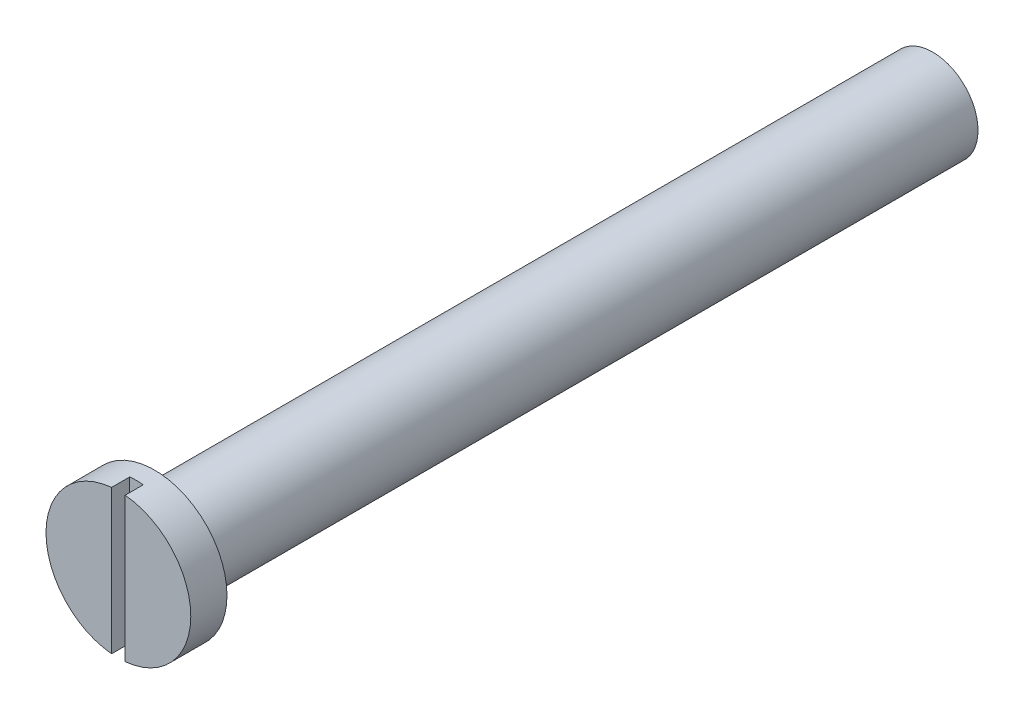
ISO-10303-21;
HEADER;
FILE_DESCRIPTION(('STEP AP214'),'2;1');
FILE_NAME('part.step','',(''),(''),'','','');
FILE_SCHEMA(('AUTOMOTIVE_DESIGN { 1 0 10303 214 1 1 1 1 }'));
ENDSEC;
DATA;
#1=APPLICATION_CONTEXT('core data for automotive mechanical design processes');
#2=APPLICATION_PROTOCOL_DEFINITION('international standard','automotive_design',2000,#1);
#3=PRODUCT_CONTEXT('',#1,'mechanical');
#4=PRODUCT('Part','Part','',(#3));
#5=PRODUCT_RELATED_PRODUCT_CATEGORY('part','',(#4));
#6=PRODUCT_DEFINITION_FORMATION('','',#4);
#7=PRODUCT_DEFINITION_CONTEXT('part definition',#1,'design');
#8=PRODUCT_DEFINITION('design','',#6,#7);
#9=PRODUCT_DEFINITION_SHAPE('','',#8);
#10=(LENGTH_UNIT() NAMED_UNIT(*) SI_UNIT(.MILLI.,.METRE.));
#11=(NAMED_UNIT(*) PLANE_ANGLE_UNIT() SI_UNIT($,.RADIAN.));
#12=(NAMED_UNIT(*) SI_UNIT($,.STERADIAN.) SOLID_ANGLE_UNIT());
#13=UNCERTAINTY_MEASURE_WITH_UNIT(LENGTH_MEASURE(1.E-05),#10,'distance_accuracy_value','');
#14=(GEOMETRIC_REPRESENTATION_CONTEXT(3) GLOBAL_UNCERTAINTY_ASSIGNED_CONTEXT((#13)) GLOBAL_UNIT_ASSIGNED_CONTEXT((#10,
#11,#12)) REPRESENTATION_CONTEXT('',''));
#15=CARTESIAN_POINT('',(0.,0.,0.));
#16=DIRECTION('',(0.,0.,1.));
#17=DIRECTION('',(1.,0.,0.));
#18=AXIS2_PLACEMENT_3D('',#15,#16,#17);
#19=CARTESIAN_POINT('',(0.,0.,90.));
#20=DIRECTION('',(0.,0.,1.));
#21=DIRECTION('',(1.,0.,0.));
#22=AXIS2_PLACEMENT_3D('',#19,#20,#21);
#23=PLANE('',#22);
#24=DIRECTION('',(0.,1.,0.));
#25=VECTOR('',#24,1.);
#26=CARTESIAN_POINT('',(0.75,0.,90.));
#27=LINE('',#26,#25);
#28=CARTESIAN_POINT('',(0.75,-7.96476616103699,90.));
#29=VERTEX_POINT('',#28);
#30=CARTESIAN_POINT('',(0.75,7.964766161037,90.));
#31=VERTEX_POINT('',#30);
#32=EDGE_CURVE('E124',#29,#31,#27,.T.);
#33=ORIENTED_EDGE('',*,*,#32,.F.);
#34=CARTESIAN_POINT('',(0.,0.,90.));
#35=DIRECTION('',(0.,0.,1.));
#36=DIRECTION('',(1.,0.,0.));
#37=AXIS2_PLACEMENT_3D('',#34,#35,#36);
#38=CIRCLE('',#37,8.);
#39=EDGE_CURVE('E111',#29,#31,#38,.T.);
#40=ORIENTED_EDGE('',*,*,#39,.T.);
#41=EDGE_LOOP('',(#33,#40));
#42=FACE_BOUND('',#41,.T.);
#43=ADVANCED_FACE('F39',(#42),#23,.T.);
#44=CARTESIAN_POINT('',(0.,0.,86.));
#45=DIRECTION('',(0.,0.,-1.));
#46=DIRECTION('',(-1.,0.,0.));
#47=AXIS2_PLACEMENT_3D('',#44,#45,#46);
#48=CYLINDRICAL_SURFACE('',#47,5.);
#49=CARTESIAN_POINT('',(0.,0.,86.));
#50=DIRECTION('',(0.,0.,1.));
#51=DIRECTION('',(1.,0.,0.));
#52=AXIS2_PLACEMENT_3D('',#49,#50,#51);
#53=CIRCLE('',#52,5.);
#54=CARTESIAN_POINT('',(5.,0.,86.));
#55=VERTEX_POINT('',#54);
#56=EDGE_CURVE('E117',#55,#55,#53,.T.);
#57=ORIENTED_EDGE('',*,*,#56,.F.);
#58=EDGE_LOOP('',(#57));
#59=FACE_BOUND('',#58,.T.);
#60=CARTESIAN_POINT('',(0.,0.,0.));
#61=DIRECTION('',(0.,0.,1.));
#62=DIRECTION('',(1.,0.,0.));
#63=AXIS2_PLACEMENT_3D('',#60,#61,#62);
#64=CIRCLE('',#63,5.);
#65=CARTESIAN_POINT('',(5.,0.,0.));
#66=VERTEX_POINT('',#65);
#67=EDGE_CURVE('E121',#66,#66,#64,.T.);
#68=ORIENTED_EDGE('',*,*,#67,.T.);
#69=EDGE_LOOP('',(#68));
#70=FACE_BOUND('',#69,.T.);
#71=ADVANCED_FACE('F41',(#59,#70),#48,.T.);
#72=CARTESIAN_POINT('',(0.,0.,0.));
#73=DIRECTION('',(0.,0.,1.));
#74=DIRECTION('',(1.,0.,0.));
#75=AXIS2_PLACEMENT_3D('',#72,#73,#74);
#76=PLANE('',#75);
#77=CARTESIAN_POINT('',(0.,0.,0.));
#78=DIRECTION('',(0.,0.,-1.));
#79=DIRECTION('',(-1.,0.,0.));
#80=AXIS2_PLACEMENT_3D('',#77,#78,#79);
#81=CIRCLE('',#80,3.4);
#82=CARTESIAN_POINT('',(-3.4,0.,0.));
#83=VERTEX_POINT('',#82);
#84=EDGE_CURVE('E93',#83,#83,#81,.T.);
#85=ORIENTED_EDGE('',*,*,#84,.F.);
#86=EDGE_LOOP('',(#85));
#87=FACE_BOUND('',#86,.T.);
#88=ORIENTED_EDGE('',*,*,#67,.F.);
#89=EDGE_LOOP('',(#88));
#90=FACE_BOUND('',#89,.T.);
#91=ADVANCED_FACE('F142',(#87,#90),#76,.F.);
#92=CARTESIAN_POINT('',(0.,0.,90.));
#93=DIRECTION('',(0.,0.,-1.));
#94=DIRECTION('',(-1.,0.,0.));
#95=AXIS2_PLACEMENT_3D('',#92,#93,#94);
#96=CYLINDRICAL_SURFACE('',#95,8.);
#97=CARTESIAN_POINT('',(0.,0.,88.));
#98=DIRECTION('',(0.,0.,1.));
#99=DIRECTION('',(1.,0.,0.));
#100=AXIS2_PLACEMENT_3D('',#97,#98,#99);
#101=CIRCLE('',#100,8.);
#102=CARTESIAN_POINT('',(0.75,7.964766161037,88.));
#103=VERTEX_POINT('',#102);
#104=CARTESIAN_POINT('',(-0.75,7.96476616103699,88.));
#105=VERTEX_POINT('',#104);
#106=EDGE_CURVE('E11',#103,#105,#101,.T.);
#107=ORIENTED_EDGE('',*,*,#106,.F.);
#108=DIRECTION('',(0.,0.,-1.));
#109=VECTOR('',#108,1.);
#110=CARTESIAN_POINT('',(0.75,7.964766161037,90.));
#111=LINE('',#110,#109);
#112=EDGE_CURVE('E62',#103,#31,#111,.F.);
#113=ORIENTED_EDGE('',*,*,#112,.T.);
#114=ORIENTED_EDGE('',*,*,#39,.F.);
#115=DIRECTION('',(0.,0.,-1.));
#116=VECTOR('',#115,1.);
#117=CARTESIAN_POINT('',(0.75,-7.964766161037,90.));
#118=LINE('',#117,#116);
#119=CARTESIAN_POINT('',(0.75,-7.964766161037,88.));
#120=VERTEX_POINT('',#119);
#121=EDGE_CURVE('E107',#29,#120,#118,.T.);
#122=ORIENTED_EDGE('',*,*,#121,.T.);
#123=CARTESIAN_POINT('',(-0.75,-7.96476616103699,88.));
#124=VERTEX_POINT('',#123);
#125=EDGE_CURVE('E43',#124,#120,#101,.T.);
#126=ORIENTED_EDGE('',*,*,#125,.F.);
#127=DIRECTION('',(0.,0.,-1.));
#128=VECTOR('',#127,1.);
#129=CARTESIAN_POINT('',(-0.75,-7.96476616103699,90.));
#130=LINE('',#129,#128);
#131=CARTESIAN_POINT('',(-0.75,-7.96476616103699,90.));
#132=VERTEX_POINT('',#131);
#133=EDGE_CURVE('E102',#124,#132,#130,.F.);
#134=ORIENTED_EDGE('',*,*,#133,.T.);
#135=CARTESIAN_POINT('',(-0.75,7.96476616103699,90.));
#136=VERTEX_POINT('',#135);
#137=EDGE_CURVE('E114',#136,#132,#38,.T.);
#138=ORIENTED_EDGE('',*,*,#137,.F.);
#139=DIRECTION('',(0.,0.,-1.));
#140=VECTOR('',#139,1.);
#141=CARTESIAN_POINT('',(-0.75,7.96476616103699,90.));
#142=LINE('',#141,#140);
#143=EDGE_CURVE('E54',#136,#105,#142,.T.);
#144=ORIENTED_EDGE('',*,*,#143,.T.);
#145=EDGE_LOOP('',(#107,#113,#114,#122,#126,#134,#138,#144));
#146=FACE_BOUND('',#145,.T.);
#147=CARTESIAN_POINT('',(0.,0.,86.));
#148=DIRECTION('',(0.,0.,1.));
#149=DIRECTION('',(1.,0.,0.));
#150=AXIS2_PLACEMENT_3D('',#147,#148,#149);
#151=CIRCLE('',#150,8.);
#152=CARTESIAN_POINT('',(8.,0.,86.));
#153=VERTEX_POINT('',#152);
#154=EDGE_CURVE('E110',#153,#153,#151,.T.);
#155=ORIENTED_EDGE('',*,*,#154,.T.);
#156=EDGE_LOOP('',(#155));
#157=FACE_BOUND('',#156,.T.);
#158=ADVANCED_FACE('F133',(#146,#157),#96,.T.);
#159=DIRECTION('',(0.,-1.,0.));
#160=VECTOR('',#159,1.);
#161=CARTESIAN_POINT('',(-0.75,0.,90.));
#162=LINE('',#161,#160);
#163=EDGE_CURVE('E120',#136,#132,#162,.T.);
#164=ORIENTED_EDGE('',*,*,#163,.F.);
#165=ORIENTED_EDGE('',*,*,#137,.T.);
#166=EDGE_LOOP('',(#164,#165));
#167=FACE_BOUND('',#166,.T.);
#168=ADVANCED_FACE('F138',(#167),#23,.T.);
#169=CARTESIAN_POINT('',(0.,0.,86.));
#170=DIRECTION('',(0.,0.,1.));
#171=DIRECTION('',(1.,0.,0.));
#172=AXIS2_PLACEMENT_3D('',#169,#170,#171);
#173=PLANE('',#172);
#174=ORIENTED_EDGE('',*,*,#56,.T.);
#175=EDGE_LOOP('',(#174));
#176=FACE_BOUND('',#175,.T.);
#177=ORIENTED_EDGE('',*,*,#154,.F.);
#178=EDGE_LOOP('',(#177));
#179=FACE_BOUND('',#178,.T.);
#180=ADVANCED_FACE('F147',(#176,#179),#173,.F.);
#181=CARTESIAN_POINT('',(0.,0.,88.));
#182=DIRECTION('',(0.,0.,1.));
#183=DIRECTION('',(1.,0.,0.));
#184=AXIS2_PLACEMENT_3D('',#181,#182,#183);
#185=PLANE('',#184);
#186=ORIENTED_EDGE('',*,*,#106,.T.);
#187=DIRECTION('',(0.,-1.,0.));
#188=VECTOR('',#187,1.);
#189=CARTESIAN_POINT('',(-0.75,9.78002511975092,88.));
#190=LINE('',#189,#188);
#191=EDGE_CURVE('E95',#105,#124,#190,.T.);
#192=ORIENTED_EDGE('',*,*,#191,.T.);
#193=ORIENTED_EDGE('',*,*,#125,.T.);
#194=DIRECTION('',(0.,1.,0.));
#195=VECTOR('',#194,1.);
#196=CARTESIAN_POINT('',(0.75,9.78002511975092,88.));
#197=LINE('',#196,#195);
#198=EDGE_CURVE('E92',#120,#103,#197,.T.);
#199=ORIENTED_EDGE('',*,*,#198,.T.);
#200=EDGE_LOOP('',(#186,#192,#193,#199));
#201=FACE_BOUND('',#200,.T.);
#202=ADVANCED_FACE('F128',(#201),#185,.T.);
#203=CARTESIAN_POINT('',(0.75,9.78002511975092,88.));
#204=DIRECTION('',(1.,0.,0.));
#205=DIRECTION('',(0.,0.,-1.));
#206=AXIS2_PLACEMENT_3D('',#203,#204,#205);
#207=PLANE('',#206);
#208=ORIENTED_EDGE('',*,*,#32,.T.);
#209=ORIENTED_EDGE('',*,*,#112,.F.);
#210=ORIENTED_EDGE('',*,*,#198,.F.);
#211=ORIENTED_EDGE('',*,*,#121,.F.);
#212=EDGE_LOOP('',(#208,#209,#210,#211));
#213=FACE_BOUND('',#212,.T.);
#214=ADVANCED_FACE('F131',(#213),#207,.F.);
#215=CARTESIAN_POINT('',(-0.75,9.78002511975092,88.));
#216=DIRECTION('',(-1.,0.,0.));
#217=DIRECTION('',(0.,0.,1.));
#218=AXIS2_PLACEMENT_3D('',#215,#216,#217);
#219=PLANE('',#218);
#220=ORIENTED_EDGE('',*,*,#163,.T.);
#221=ORIENTED_EDGE('',*,*,#133,.F.);
#222=ORIENTED_EDGE('',*,*,#191,.F.);
#223=ORIENTED_EDGE('',*,*,#143,.F.);
#224=EDGE_LOOP('',(#220,#221,#222,#223));
#225=FACE_BOUND('',#224,.T.);
#226=ADVANCED_FACE('F86',(#225),#219,.F.);
#227=CARTESIAN_POINT('',(0.,0.,15.));
#228=DIRECTION('',(0.,0.,-1.));
#229=DIRECTION('',(-1.,0.,0.));
#230=AXIS2_PLACEMENT_3D('',#227,#228,#229);
#231=CONICAL_SURFACE('',#230,3.39999999999998,1.02974425867665);
#232=CARTESIAN_POINT('',(0.,0.,17.0429261046937));
#233=VERTEX_POINT('',#232);
#234=VERTEX_LOOP('',#233);
#235=FACE_BOUND('',#234,.T.);
#236=CARTESIAN_POINT('',(0.,0.,15.));
#237=DIRECTION('',(0.,0.,-1.));
#238=DIRECTION('',(-1.,0.,0.));
#239=AXIS2_PLACEMENT_3D('',#236,#237,#238);
#240=CIRCLE('',#239,3.39999999999998);
#241=CARTESIAN_POINT('',(-3.39999999999998,0.,15.));
#242=VERTEX_POINT('',#241);
#243=EDGE_CURVE('E90',#242,#242,#240,.T.);
#244=ORIENTED_EDGE('',*,*,#243,.T.);
#245=EDGE_LOOP('',(#244));
#246=FACE_BOUND('',#245,.T.);
#247=ADVANCED_FACE('F82',(#235,#246),#231,.F.);
#248=CARTESIAN_POINT('',(0.,0.,0.));
#249=DIRECTION('',(0.,0.,-1.));
#250=DIRECTION('',(-1.,0.,0.));
#251=AXIS2_PLACEMENT_3D('',#248,#249,#250);
#252=CYLINDRICAL_SURFACE('',#251,3.39999999999999);
#253=ORIENTED_EDGE('',*,*,#243,.F.);
#254=EDGE_LOOP('',(#253));
#255=FACE_BOUND('',#254,.T.);
#256=ORIENTED_EDGE('',*,*,#84,.T.);
#257=EDGE_LOOP('',(#256));
#258=FACE_BOUND('',#257,.T.);
#259=ADVANCED_FACE('F85',(#255,#258),#252,.F.);
#260=CLOSED_SHELL('',(#43,#71,#91,#158,#168,#180,#202,#214,#226,#247,#259));
#261=MANIFOLD_SOLID_BREP('B2',#260);
#262=ADVANCED_BREP_SHAPE_REPRESENTATION('',(#18,#261),#14);
#263=SHAPE_DEFINITION_REPRESENTATION(#9,#262);
ENDSEC;
END-ISO-10303-21;
